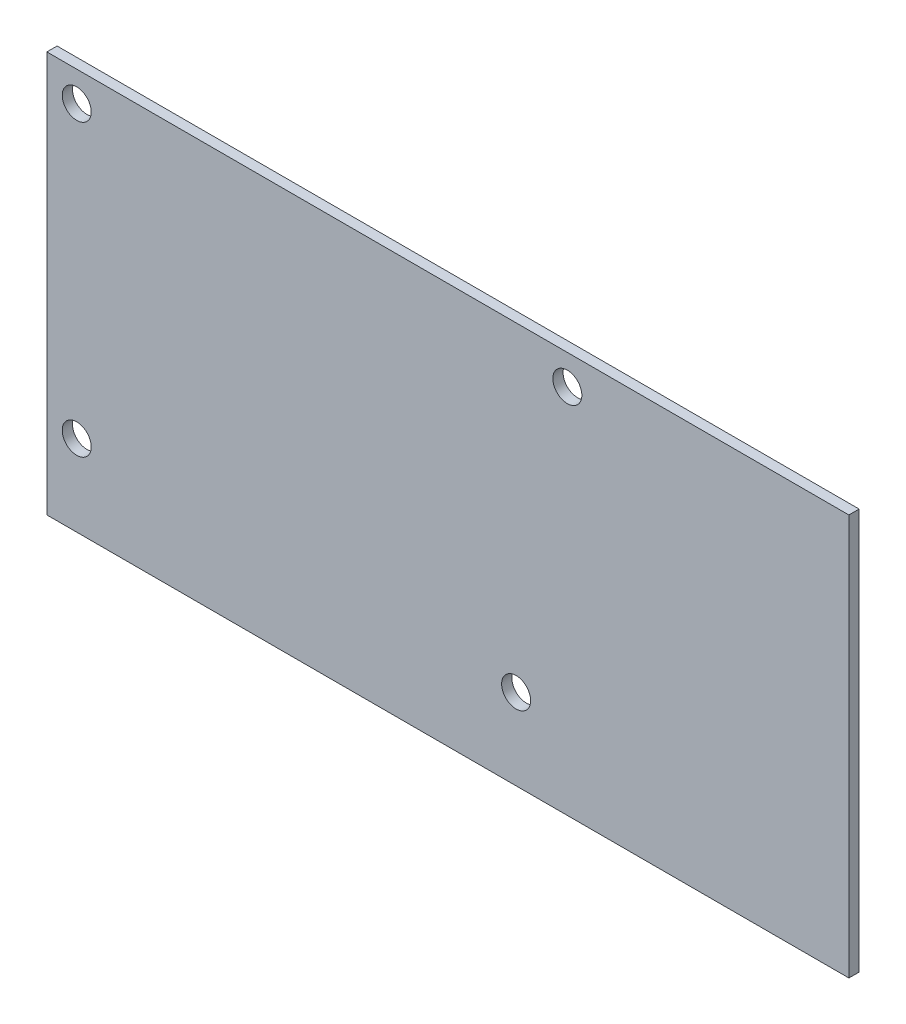
ISO-10303-21;
HEADER;
FILE_DESCRIPTION(('STEP AP214'),'2;1');
FILE_NAME('part.step','',(''),(''),'','','');
FILE_SCHEMA(('AUTOMOTIVE_DESIGN { 1 0 10303 214 1 1 1 1 }'));
ENDSEC;
DATA;
#1=APPLICATION_CONTEXT('core data for automotive mechanical design processes');
#2=APPLICATION_PROTOCOL_DEFINITION('international standard','automotive_design',2000,#1);
#3=PRODUCT_CONTEXT('',#1,'mechanical');
#4=PRODUCT('Part','Part','',(#3));
#5=PRODUCT_RELATED_PRODUCT_CATEGORY('part','',(#4));
#6=PRODUCT_DEFINITION_FORMATION('','',#4);
#7=PRODUCT_DEFINITION_CONTEXT('part definition',#1,'design');
#8=PRODUCT_DEFINITION('design','',#6,#7);
#9=PRODUCT_DEFINITION_SHAPE('','',#8);
#10=(LENGTH_UNIT() NAMED_UNIT(*) SI_UNIT(.MILLI.,.METRE.));
#11=(NAMED_UNIT(*) PLANE_ANGLE_UNIT() SI_UNIT($,.RADIAN.));
#12=(NAMED_UNIT(*) SI_UNIT($,.STERADIAN.) SOLID_ANGLE_UNIT());
#13=UNCERTAINTY_MEASURE_WITH_UNIT(LENGTH_MEASURE(1.E-05),#10,'distance_accuracy_value','');
#14=(GEOMETRIC_REPRESENTATION_CONTEXT(3) GLOBAL_UNCERTAINTY_ASSIGNED_CONTEXT((#13)) GLOBAL_UNIT_ASSIGNED_CONTEXT((#10,
#11,#12)) REPRESENTATION_CONTEXT('',''));
#15=CARTESIAN_POINT('',(0.,0.,0.));
#16=DIRECTION('',(0.,0.,1.));
#17=DIRECTION('',(1.,0.,0.));
#18=AXIS2_PLACEMENT_3D('',#15,#16,#17);
#19=CARTESIAN_POINT('',(47.,23.5,1.2));
#20=DIRECTION('',(-1.,0.,0.));
#21=DIRECTION('',(0.,-1.,0.));
#22=AXIS2_PLACEMENT_3D('',#19,#20,#21);
#23=PLANE('',#22);
#24=DIRECTION('',(0.,1.,0.));
#25=VECTOR('',#24,1.);
#26=CARTESIAN_POINT('',(47.,23.5,0.));
#27=LINE('',#26,#25);
#28=CARTESIAN_POINT('',(47.,-23.5,0.));
#29=VERTEX_POINT('',#28);
#30=CARTESIAN_POINT('',(47.,23.5,0.));
#31=VERTEX_POINT('',#30);
#32=EDGE_CURVE('E97',#29,#31,#27,.T.);
#33=ORIENTED_EDGE('',*,*,#32,.T.);
#34=DIRECTION('',(0.,0.,-1.));
#35=VECTOR('',#34,1.);
#36=CARTESIAN_POINT('',(47.,23.5,1.2));
#37=LINE('',#36,#35);
#38=CARTESIAN_POINT('',(47.,23.5,1.2));
#39=VERTEX_POINT('',#38);
#40=EDGE_CURVE('E11',#39,#31,#37,.T.);
#41=ORIENTED_EDGE('',*,*,#40,.F.);
#42=DIRECTION('',(0.,1.,0.));
#43=VECTOR('',#42,1.);
#44=CARTESIAN_POINT('',(47.,23.5,1.2));
#45=LINE('',#44,#43);
#46=CARTESIAN_POINT('',(47.,-23.5,1.2));
#47=VERTEX_POINT('',#46);
#48=EDGE_CURVE('E85',#47,#39,#45,.T.);
#49=ORIENTED_EDGE('',*,*,#48,.F.);
#50=DIRECTION('',(0.,0.,-1.));
#51=VECTOR('',#50,1.);
#52=CARTESIAN_POINT('',(47.,-23.5,1.2));
#53=LINE('',#52,#51);
#54=EDGE_CURVE('E93',#47,#29,#53,.T.);
#55=ORIENTED_EDGE('',*,*,#54,.T.);
#56=EDGE_LOOP('',(#33,#41,#49,#55));
#57=FACE_BOUND('',#56,.T.);
#58=ADVANCED_FACE('F34',(#57),#23,.F.);
#59=CARTESIAN_POINT('',(-47.,23.5,1.2));
#60=DIRECTION('',(0.,-1.,0.));
#61=DIRECTION('',(1.,0.,0.));
#62=AXIS2_PLACEMENT_3D('',#59,#60,#61);
#63=PLANE('',#62);
#64=DIRECTION('',(-1.,0.,0.));
#65=VECTOR('',#64,1.);
#66=CARTESIAN_POINT('',(-47.,23.5,0.));
#67=LINE('',#66,#65);
#68=CARTESIAN_POINT('',(-47.,23.5,0.));
#69=VERTEX_POINT('',#68);
#70=EDGE_CURVE('E89',#31,#69,#67,.T.);
#71=ORIENTED_EDGE('',*,*,#70,.T.);
#72=DIRECTION('',(0.,0.,-1.));
#73=VECTOR('',#72,1.);
#74=CARTESIAN_POINT('',(-47.,23.5,1.2));
#75=LINE('',#74,#73);
#76=CARTESIAN_POINT('',(-47.,23.5,1.2));
#77=VERTEX_POINT('',#76);
#78=EDGE_CURVE('E42',#77,#69,#75,.T.);
#79=ORIENTED_EDGE('',*,*,#78,.F.);
#80=DIRECTION('',(-1.,0.,0.));
#81=VECTOR('',#80,1.);
#82=CARTESIAN_POINT('',(-47.,23.5,1.2));
#83=LINE('',#82,#81);
#84=EDGE_CURVE('E80',#39,#77,#83,.T.);
#85=ORIENTED_EDGE('',*,*,#84,.F.);
#86=ORIENTED_EDGE('',*,*,#40,.T.);
#87=EDGE_LOOP('',(#71,#79,#85,#86));
#88=FACE_BOUND('',#87,.T.);
#89=ADVANCED_FACE('F88',(#88),#63,.F.);
#90=CARTESIAN_POINT('',(-47.,23.5,1.2));
#91=DIRECTION('',(1.,0.,0.));
#92=DIRECTION('',(0.,0.,-1.));
#93=AXIS2_PLACEMENT_3D('',#90,#91,#92);
#94=PLANE('',#93);
#95=DIRECTION('',(0.,-1.,0.));
#96=VECTOR('',#95,1.);
#97=CARTESIAN_POINT('',(-47.,23.5,0.));
#98=LINE('',#97,#96);
#99=CARTESIAN_POINT('',(-47.,-23.5,0.));
#100=VERTEX_POINT('',#99);
#101=EDGE_CURVE('E67',#69,#100,#98,.T.);
#102=ORIENTED_EDGE('',*,*,#101,.T.);
#103=DIRECTION('',(0.,0.,-1.));
#104=VECTOR('',#103,1.);
#105=CARTESIAN_POINT('',(-47.,-23.5,1.2));
#106=LINE('',#105,#104);
#107=CARTESIAN_POINT('',(-47.,-23.5,1.2));
#108=VERTEX_POINT('',#107);
#109=EDGE_CURVE('E90',#108,#100,#106,.T.);
#110=ORIENTED_EDGE('',*,*,#109,.F.);
#111=DIRECTION('',(0.,-1.,0.));
#112=VECTOR('',#111,1.);
#113=CARTESIAN_POINT('',(-47.,23.5,1.2));
#114=LINE('',#113,#112);
#115=EDGE_CURVE('E83',#77,#108,#114,.T.);
#116=ORIENTED_EDGE('',*,*,#115,.F.);
#117=ORIENTED_EDGE('',*,*,#78,.T.);
#118=EDGE_LOOP('',(#102,#110,#116,#117));
#119=FACE_BOUND('',#118,.T.);
#120=ADVANCED_FACE('F91',(#119),#94,.F.);
#121=CARTESIAN_POINT('',(-47.,-23.5,1.2));
#122=DIRECTION('',(0.,1.,0.));
#123=DIRECTION('',(-1.,0.,0.));
#124=AXIS2_PLACEMENT_3D('',#121,#122,#123);
#125=PLANE('',#124);
#126=DIRECTION('',(1.,0.,0.));
#127=VECTOR('',#126,1.);
#128=CARTESIAN_POINT('',(-47.,-23.5,0.));
#129=LINE('',#128,#127);
#130=EDGE_CURVE('E73',#100,#29,#129,.T.);
#131=ORIENTED_EDGE('',*,*,#130,.T.);
#132=ORIENTED_EDGE('',*,*,#54,.F.);
#133=DIRECTION('',(1.,0.,0.));
#134=VECTOR('',#133,1.);
#135=CARTESIAN_POINT('',(-47.,-23.5,1.2));
#136=LINE('',#135,#134);
#137=EDGE_CURVE('E50',#108,#47,#136,.T.);
#138=ORIENTED_EDGE('',*,*,#137,.F.);
#139=ORIENTED_EDGE('',*,*,#109,.T.);
#140=EDGE_LOOP('',(#131,#132,#138,#139));
#141=FACE_BOUND('',#140,.T.);
#142=ADVANCED_FACE('F105',(#141),#125,.F.);
#143=CARTESIAN_POINT('',(0.,0.,1.2));
#144=DIRECTION('',(0.,0.,1.));
#145=DIRECTION('',(1.,0.,0.));
#146=AXIS2_PLACEMENT_3D('',#143,#144,#145);
#147=PLANE('',#146);
#148=CARTESIAN_POINT('',(14.,20.,1.2));
#149=DIRECTION('',(0.,0.,1.));
#150=DIRECTION('',(1.,0.,0.));
#151=AXIS2_PLACEMENT_3D('',#148,#149,#150);
#152=CIRCLE('',#151,1.7);
#153=CARTESIAN_POINT('',(15.7,20.,1.2));
#154=VERTEX_POINT('',#153);
#155=EDGE_CURVE('E127',#154,#154,#152,.T.);
#156=ORIENTED_EDGE('',*,*,#155,.F.);
#157=EDGE_LOOP('',(#156));
#158=FACE_BOUND('',#157,.T.);
#159=CARTESIAN_POINT('',(8.,-14.,1.2));
#160=DIRECTION('',(0.,0.,1.));
#161=DIRECTION('',(1.,0.,0.));
#162=AXIS2_PLACEMENT_3D('',#159,#160,#161);
#163=CIRCLE('',#162,1.7);
#164=CARTESIAN_POINT('',(9.7,-14.,1.2));
#165=VERTEX_POINT('',#164);
#166=EDGE_CURVE('E121',#165,#165,#163,.T.);
#167=ORIENTED_EDGE('',*,*,#166,.F.);
#168=EDGE_LOOP('',(#167));
#169=FACE_BOUND('',#168,.T.);
#170=CARTESIAN_POINT('',(-43.5,-14.,1.2));
#171=DIRECTION('',(0.,0.,1.));
#172=DIRECTION('',(1.,0.,0.));
#173=AXIS2_PLACEMENT_3D('',#170,#171,#172);
#174=CIRCLE('',#173,1.7);
#175=CARTESIAN_POINT('',(-41.8,-14.,1.2));
#176=VERTEX_POINT('',#175);
#177=EDGE_CURVE('E114',#176,#176,#174,.T.);
#178=ORIENTED_EDGE('',*,*,#177,.F.);
#179=EDGE_LOOP('',(#178));
#180=FACE_BOUND('',#179,.T.);
#181=CARTESIAN_POINT('',(-43.5,20.,1.2));
#182=DIRECTION('',(0.,0.,1.));
#183=DIRECTION('',(1.,0.,0.));
#184=AXIS2_PLACEMENT_3D('',#181,#182,#183);
#185=CIRCLE('',#184,1.7);
#186=CARTESIAN_POINT('',(-41.8,20.,1.2));
#187=VERTEX_POINT('',#186);
#188=EDGE_CURVE('E115',#187,#187,#185,.T.);
#189=ORIENTED_EDGE('',*,*,#188,.F.);
#190=EDGE_LOOP('',(#189));
#191=FACE_BOUND('',#190,.T.);
#192=ORIENTED_EDGE('',*,*,#48,.T.);
#193=ORIENTED_EDGE('',*,*,#84,.T.);
#194=ORIENTED_EDGE('',*,*,#115,.T.);
#195=ORIENTED_EDGE('',*,*,#137,.T.);
#196=EDGE_LOOP('',(#192,#193,#194,#195));
#197=FACE_BOUND('',#196,.T.);
#198=ADVANCED_FACE('F81',(#158,#169,#180,#191,#197),#147,.T.);
#199=CARTESIAN_POINT('',(0.,0.,0.));
#200=DIRECTION('',(0.,0.,1.));
#201=DIRECTION('',(1.,0.,0.));
#202=AXIS2_PLACEMENT_3D('',#199,#200,#201);
#203=PLANE('',#202);
#204=CARTESIAN_POINT('',(14.,20.,0.));
#205=DIRECTION('',(0.,0.,1.));
#206=DIRECTION('',(1.,0.,0.));
#207=AXIS2_PLACEMENT_3D('',#204,#205,#206);
#208=CIRCLE('',#207,1.7);
#209=CARTESIAN_POINT('',(15.7,20.,0.));
#210=VERTEX_POINT('',#209);
#211=EDGE_CURVE('E100',#210,#210,#208,.F.);
#212=ORIENTED_EDGE('',*,*,#211,.F.);
#213=EDGE_LOOP('',(#212));
#214=FACE_BOUND('',#213,.T.);
#215=CARTESIAN_POINT('',(8.,-14.,0.));
#216=DIRECTION('',(0.,0.,1.));
#217=DIRECTION('',(1.,0.,0.));
#218=AXIS2_PLACEMENT_3D('',#215,#216,#217);
#219=CIRCLE('',#218,1.7);
#220=CARTESIAN_POINT('',(9.7,-14.,0.));
#221=VERTEX_POINT('',#220);
#222=EDGE_CURVE('E124',#221,#221,#219,.F.);
#223=ORIENTED_EDGE('',*,*,#222,.F.);
#224=EDGE_LOOP('',(#223));
#225=FACE_BOUND('',#224,.T.);
#226=CARTESIAN_POINT('',(-43.5,-14.,0.));
#227=DIRECTION('',(0.,0.,1.));
#228=DIRECTION('',(1.,0.,0.));
#229=AXIS2_PLACEMENT_3D('',#226,#227,#228);
#230=CIRCLE('',#229,1.7);
#231=CARTESIAN_POINT('',(-41.8,-14.,0.));
#232=VERTEX_POINT('',#231);
#233=EDGE_CURVE('E118',#232,#232,#230,.F.);
#234=ORIENTED_EDGE('',*,*,#233,.F.);
#235=EDGE_LOOP('',(#234));
#236=FACE_BOUND('',#235,.T.);
#237=CARTESIAN_POINT('',(-43.5,20.,0.));
#238=DIRECTION('',(0.,0.,1.));
#239=DIRECTION('',(1.,0.,0.));
#240=AXIS2_PLACEMENT_3D('',#237,#238,#239);
#241=CIRCLE('',#240,1.7);
#242=CARTESIAN_POINT('',(-41.8,20.,0.));
#243=VERTEX_POINT('',#242);
#244=EDGE_CURVE('E111',#243,#243,#241,.F.);
#245=ORIENTED_EDGE('',*,*,#244,.F.);
#246=EDGE_LOOP('',(#245));
#247=FACE_BOUND('',#246,.T.);
#248=ORIENTED_EDGE('',*,*,#32,.F.);
#249=ORIENTED_EDGE('',*,*,#130,.F.);
#250=ORIENTED_EDGE('',*,*,#101,.F.);
#251=ORIENTED_EDGE('',*,*,#70,.F.);
#252=EDGE_LOOP('',(#248,#249,#250,#251));
#253=FACE_BOUND('',#252,.T.);
#254=ADVANCED_FACE('F108',(#214,#225,#236,#247,#253),#203,.F.);
#255=CARTESIAN_POINT('',(-43.5,20.,-0.000999999999999916));
#256=DIRECTION('',(0.,0.,1.));
#257=DIRECTION('',(1.,0.,0.));
#258=AXIS2_PLACEMENT_3D('',#255,#256,#257);
#259=CYLINDRICAL_SURFACE('',#258,1.7);
#260=ORIENTED_EDGE('',*,*,#188,.T.);
#261=EDGE_LOOP('',(#260));
#262=FACE_BOUND('',#261,.T.);
#263=ORIENTED_EDGE('',*,*,#244,.T.);
#264=EDGE_LOOP('',(#263));
#265=FACE_BOUND('',#264,.T.);
#266=ADVANCED_FACE('F147',(#262,#265),#259,.F.);
#267=CARTESIAN_POINT('',(-43.5,-14.,-0.000999999999999916));
#268=DIRECTION('',(0.,0.,1.));
#269=DIRECTION('',(1.,0.,0.));
#270=AXIS2_PLACEMENT_3D('',#267,#268,#269);
#271=CYLINDRICAL_SURFACE('',#270,1.7);
#272=ORIENTED_EDGE('',*,*,#177,.T.);
#273=EDGE_LOOP('',(#272));
#274=FACE_BOUND('',#273,.T.);
#275=ORIENTED_EDGE('',*,*,#233,.T.);
#276=EDGE_LOOP('',(#275));
#277=FACE_BOUND('',#276,.T.);
#278=ADVANCED_FACE('F150',(#274,#277),#271,.F.);
#279=CARTESIAN_POINT('',(8.,-14.,-0.000999999999999916));
#280=DIRECTION('',(0.,0.,1.));
#281=DIRECTION('',(1.,0.,0.));
#282=AXIS2_PLACEMENT_3D('',#279,#280,#281);
#283=CYLINDRICAL_SURFACE('',#282,1.7);
#284=ORIENTED_EDGE('',*,*,#166,.T.);
#285=EDGE_LOOP('',(#284));
#286=FACE_BOUND('',#285,.T.);
#287=ORIENTED_EDGE('',*,*,#222,.T.);
#288=EDGE_LOOP('',(#287));
#289=FACE_BOUND('',#288,.T.);
#290=ADVANCED_FACE('F211',(#286,#289),#283,.F.);
#291=CARTESIAN_POINT('',(14.,20.,-0.000999999999999916));
#292=DIRECTION('',(0.,0.,1.));
#293=DIRECTION('',(1.,0.,0.));
#294=AXIS2_PLACEMENT_3D('',#291,#292,#293);
#295=CYLINDRICAL_SURFACE('',#294,1.7);
#296=ORIENTED_EDGE('',*,*,#155,.T.);
#297=EDGE_LOOP('',(#296));
#298=FACE_BOUND('',#297,.T.);
#299=ORIENTED_EDGE('',*,*,#211,.T.);
#300=EDGE_LOOP('',(#299));
#301=FACE_BOUND('',#300,.T.);
#302=ADVANCED_FACE('F135',(#298,#301),#295,.F.);
#303=CLOSED_SHELL('',(#58,#89,#120,#142,#198,#254,#266,#278,#290,#302));
#304=MANIFOLD_SOLID_BREP('B2',#303);
#305=ADVANCED_BREP_SHAPE_REPRESENTATION('',(#18,#304),#14);
#306=SHAPE_DEFINITION_REPRESENTATION(#9,#305);
ENDSEC;
END-ISO-10303-21;
